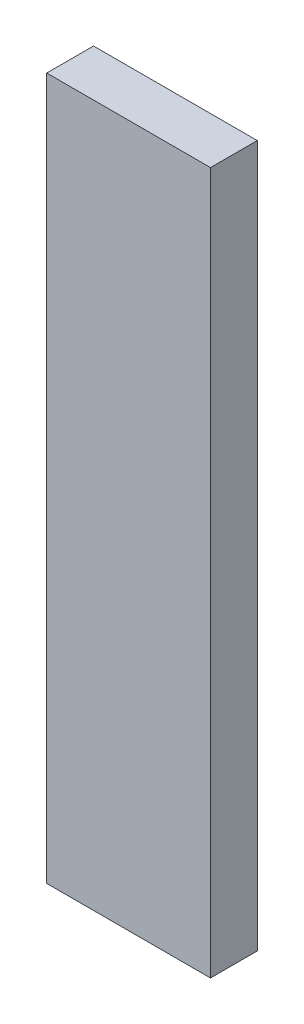
ISO-10303-21;
HEADER;
FILE_DESCRIPTION(('STEP AP214'),'2;1');
FILE_NAME('part.step','',(''),(''),'','','');
FILE_SCHEMA(('AUTOMOTIVE_DESIGN { 1 0 10303 214 1 1 1 1 }'));
ENDSEC;
DATA;
#1=APPLICATION_CONTEXT('core data for automotive mechanical design processes');
#2=APPLICATION_PROTOCOL_DEFINITION('international standard','automotive_design',2000,#1);
#3=PRODUCT_CONTEXT('',#1,'mechanical');
#4=PRODUCT('Part','Part','',(#3));
#5=PRODUCT_RELATED_PRODUCT_CATEGORY('part','',(#4));
#6=PRODUCT_DEFINITION_FORMATION('','',#4);
#7=PRODUCT_DEFINITION_CONTEXT('part definition',#1,'design');
#8=PRODUCT_DEFINITION('design','',#6,#7);
#9=PRODUCT_DEFINITION_SHAPE('','',#8);
#10=(LENGTH_UNIT() NAMED_UNIT(*) SI_UNIT(.MILLI.,.METRE.));
#11=(NAMED_UNIT(*) PLANE_ANGLE_UNIT() SI_UNIT($,.RADIAN.));
#12=(NAMED_UNIT(*) SI_UNIT($,.STERADIAN.) SOLID_ANGLE_UNIT());
#13=UNCERTAINTY_MEASURE_WITH_UNIT(LENGTH_MEASURE(1.E-05),#10,'distance_accuracy_value','');
#14=(GEOMETRIC_REPRESENTATION_CONTEXT(3) GLOBAL_UNCERTAINTY_ASSIGNED_CONTEXT((#13)) GLOBAL_UNIT_ASSIGNED_CONTEXT((#10,
#11,#12)) REPRESENTATION_CONTEXT('',''));
#15=CARTESIAN_POINT('',(0.,0.,0.));
#16=DIRECTION('',(0.,0.,1.));
#17=DIRECTION('',(1.,0.,0.));
#18=AXIS2_PLACEMENT_3D('',#15,#16,#17);
#19=CARTESIAN_POINT('',(5.25,22.5,-3.));
#20=DIRECTION('',(1.,0.,0.));
#21=DIRECTION('',(0.,1.,0.));
#22=AXIS2_PLACEMENT_3D('',#19,#20,#21);
#23=PLANE('',#22);
#24=DIRECTION('',(0.,1.,0.));
#25=VECTOR('',#24,1.);
#26=CARTESIAN_POINT('',(5.25,22.5,0.));
#27=LINE('',#26,#25);
#28=CARTESIAN_POINT('',(5.25,-22.5,0.));
#29=VERTEX_POINT('',#28);
#30=CARTESIAN_POINT('',(5.25,22.5,0.));
#31=VERTEX_POINT('',#30);
#32=EDGE_CURVE('E96',#29,#31,#27,.T.);
#33=ORIENTED_EDGE('',*,*,#32,.F.);
#34=DIRECTION('',(0.,0.,1.));
#35=VECTOR('',#34,1.);
#36=CARTESIAN_POINT('',(5.25,-22.5,-3.));
#37=LINE('',#36,#35);
#38=CARTESIAN_POINT('',(5.25,-22.5,-3.));
#39=VERTEX_POINT('',#38);
#40=EDGE_CURVE('E11',#39,#29,#37,.T.);
#41=ORIENTED_EDGE('',*,*,#40,.F.);
#42=DIRECTION('',(0.,1.,0.));
#43=VECTOR('',#42,1.);
#44=CARTESIAN_POINT('',(5.25,22.5,-3.));
#45=LINE('',#44,#43);
#46=CARTESIAN_POINT('',(5.25,22.5,-3.));
#47=VERTEX_POINT('',#46);
#48=EDGE_CURVE('E90',#39,#47,#45,.T.);
#49=ORIENTED_EDGE('',*,*,#48,.T.);
#50=DIRECTION('',(0.,0.,1.));
#51=VECTOR('',#50,1.);
#52=CARTESIAN_POINT('',(5.25,22.5,-3.));
#53=LINE('',#52,#51);
#54=EDGE_CURVE('E35',#47,#31,#53,.T.);
#55=ORIENTED_EDGE('',*,*,#54,.T.);
#56=EDGE_LOOP('',(#33,#41,#49,#55));
#57=FACE_BOUND('',#56,.T.);
#58=ADVANCED_FACE('F32',(#57),#23,.T.);
#59=CARTESIAN_POINT('',(-5.25,-22.5,-3.));
#60=DIRECTION('',(0.,-1.,0.));
#61=DIRECTION('',(0.,0.,-1.));
#62=AXIS2_PLACEMENT_3D('',#59,#60,#61);
#63=PLANE('',#62);
#64=DIRECTION('',(1.,0.,0.));
#65=VECTOR('',#64,1.);
#66=CARTESIAN_POINT('',(-5.25,-22.5,0.));
#67=LINE('',#66,#65);
#68=CARTESIAN_POINT('',(-5.25,-22.5,0.));
#69=VERTEX_POINT('',#68);
#70=EDGE_CURVE('E92',#69,#29,#67,.T.);
#71=ORIENTED_EDGE('',*,*,#70,.F.);
#72=DIRECTION('',(0.,0.,1.));
#73=VECTOR('',#72,1.);
#74=CARTESIAN_POINT('',(-5.25,-22.5,-3.));
#75=LINE('',#74,#73);
#76=CARTESIAN_POINT('',(-5.25,-22.5,-3.));
#77=VERTEX_POINT('',#76);
#78=EDGE_CURVE('E41',#77,#69,#75,.T.);
#79=ORIENTED_EDGE('',*,*,#78,.F.);
#80=DIRECTION('',(1.,0.,0.));
#81=VECTOR('',#80,1.);
#82=CARTESIAN_POINT('',(-5.25,-22.5,-3.));
#83=LINE('',#82,#81);
#84=EDGE_CURVE('E87',#77,#39,#83,.T.);
#85=ORIENTED_EDGE('',*,*,#84,.T.);
#86=ORIENTED_EDGE('',*,*,#40,.T.);
#87=EDGE_LOOP('',(#71,#79,#85,#86));
#88=FACE_BOUND('',#87,.T.);
#89=ADVANCED_FACE('F106',(#88),#63,.T.);
#90=CARTESIAN_POINT('',(-5.25,22.5,-3.));
#91=DIRECTION('',(-1.,0.,0.));
#92=DIRECTION('',(0.,-1.,0.));
#93=AXIS2_PLACEMENT_3D('',#90,#91,#92);
#94=PLANE('',#93);
#95=DIRECTION('',(0.,-1.,0.));
#96=VECTOR('',#95,1.);
#97=CARTESIAN_POINT('',(-5.25,22.5,0.));
#98=LINE('',#97,#96);
#99=CARTESIAN_POINT('',(-5.25,22.5,0.));
#100=VERTEX_POINT('',#99);
#101=EDGE_CURVE('E82',#100,#69,#98,.T.);
#102=ORIENTED_EDGE('',*,*,#101,.F.);
#103=DIRECTION('',(0.,0.,1.));
#104=VECTOR('',#103,1.);
#105=CARTESIAN_POINT('',(-5.25,22.5,-3.));
#106=LINE('',#105,#104);
#107=CARTESIAN_POINT('',(-5.25,22.5,-3.));
#108=VERTEX_POINT('',#107);
#109=EDGE_CURVE('E77',#108,#100,#106,.T.);
#110=ORIENTED_EDGE('',*,*,#109,.F.);
#111=DIRECTION('',(0.,-1.,0.));
#112=VECTOR('',#111,1.);
#113=CARTESIAN_POINT('',(-5.25,22.5,-3.));
#114=LINE('',#113,#112);
#115=EDGE_CURVE('E80',#108,#77,#114,.T.);
#116=ORIENTED_EDGE('',*,*,#115,.T.);
#117=ORIENTED_EDGE('',*,*,#78,.T.);
#118=EDGE_LOOP('',(#102,#110,#116,#117));
#119=FACE_BOUND('',#118,.T.);
#120=ADVANCED_FACE('F79',(#119),#94,.T.);
#121=CARTESIAN_POINT('',(-5.25,22.5,-3.));
#122=DIRECTION('',(0.,1.,0.));
#123=DIRECTION('',(0.,0.,1.));
#124=AXIS2_PLACEMENT_3D('',#121,#122,#123);
#125=PLANE('',#124);
#126=DIRECTION('',(-1.,0.,0.));
#127=VECTOR('',#126,1.);
#128=CARTESIAN_POINT('',(-5.25,22.5,0.));
#129=LINE('',#128,#127);
#130=EDGE_CURVE('E99',#31,#100,#129,.T.);
#131=ORIENTED_EDGE('',*,*,#130,.F.);
#132=ORIENTED_EDGE('',*,*,#54,.F.);
#133=DIRECTION('',(-1.,0.,0.));
#134=VECTOR('',#133,1.);
#135=CARTESIAN_POINT('',(-5.25,22.5,-3.));
#136=LINE('',#135,#134);
#137=EDGE_CURVE('E86',#47,#108,#136,.T.);
#138=ORIENTED_EDGE('',*,*,#137,.T.);
#139=ORIENTED_EDGE('',*,*,#109,.T.);
#140=EDGE_LOOP('',(#131,#132,#138,#139));
#141=FACE_BOUND('',#140,.T.);
#142=ADVANCED_FACE('F89',(#141),#125,.T.);
#143=CARTESIAN_POINT('',(0.,0.,-3.));
#144=DIRECTION('',(0.,0.,1.));
#145=DIRECTION('',(1.,0.,0.));
#146=AXIS2_PLACEMENT_3D('',#143,#144,#145);
#147=PLANE('',#146);
#148=ORIENTED_EDGE('',*,*,#48,.F.);
#149=ORIENTED_EDGE('',*,*,#84,.F.);
#150=ORIENTED_EDGE('',*,*,#115,.F.);
#151=ORIENTED_EDGE('',*,*,#137,.F.);
#152=EDGE_LOOP('',(#148,#149,#150,#151));
#153=FACE_BOUND('',#152,.T.);
#154=ADVANCED_FACE('F85',(#153),#147,.F.);
#155=CARTESIAN_POINT('',(0.,0.,0.));
#156=DIRECTION('',(0.,0.,1.));
#157=DIRECTION('',(1.,0.,0.));
#158=AXIS2_PLACEMENT_3D('',#155,#156,#157);
#159=PLANE('',#158);
#160=ORIENTED_EDGE('',*,*,#32,.T.);
#161=ORIENTED_EDGE('',*,*,#130,.T.);
#162=ORIENTED_EDGE('',*,*,#101,.T.);
#163=ORIENTED_EDGE('',*,*,#70,.T.);
#164=EDGE_LOOP('',(#160,#161,#162,#163));
#165=FACE_BOUND('',#164,.T.);
#166=ADVANCED_FACE('F105',(#165),#159,.T.);
#167=CLOSED_SHELL('',(#58,#89,#120,#142,#154,#166));
#168=MANIFOLD_SOLID_BREP('B2',#167);
#169=ADVANCED_BREP_SHAPE_REPRESENTATION('',(#18,#168),#14);
#170=SHAPE_DEFINITION_REPRESENTATION(#9,#169);
ENDSEC;
END-ISO-10303-21;
